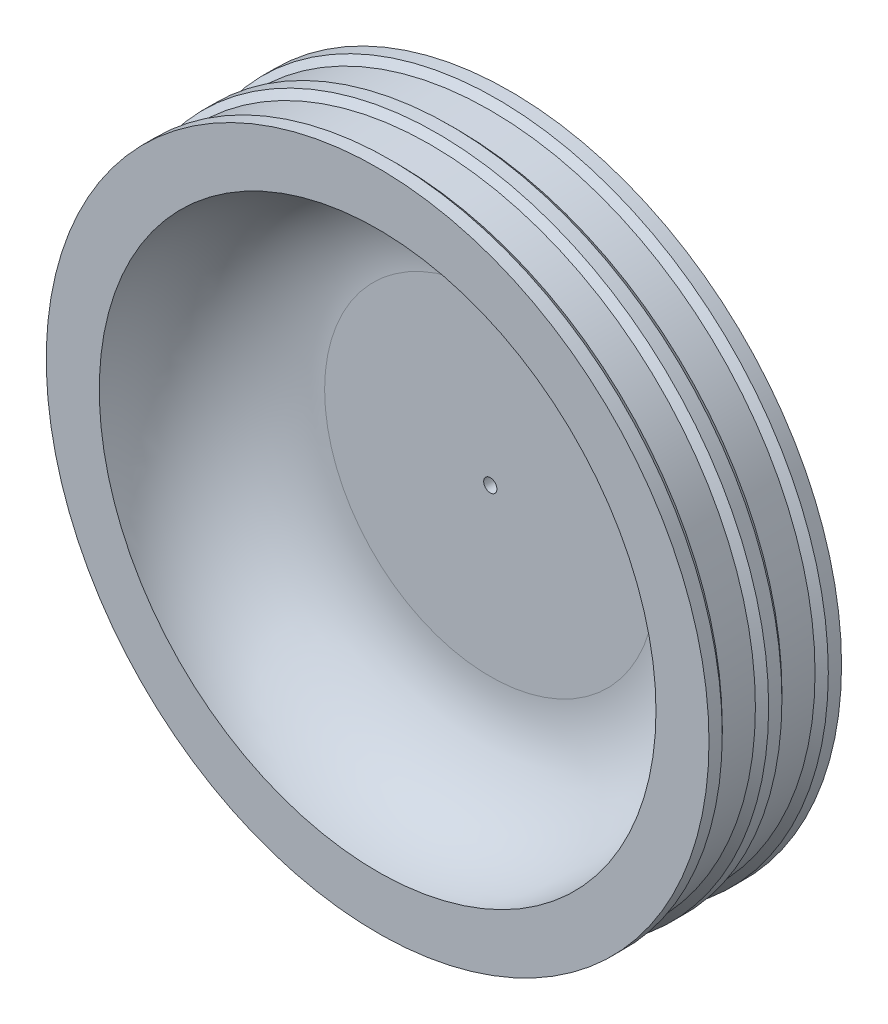
ISO-10303-21;
HEADER;
FILE_DESCRIPTION(('STEP AP214'),'2;1');
FILE_NAME('part.step','',(''),(''),'','','');
FILE_SCHEMA(('AUTOMOTIVE_DESIGN { 1 0 10303 214 1 1 1 1 }'));
ENDSEC;
DATA;
#1=APPLICATION_CONTEXT('core data for automotive mechanical design processes');
#2=APPLICATION_PROTOCOL_DEFINITION('international standard','automotive_design',2000,#1);
#3=PRODUCT_CONTEXT('',#1,'mechanical');
#4=PRODUCT('Part','Part','',(#3));
#5=PRODUCT_RELATED_PRODUCT_CATEGORY('part','',(#4));
#6=PRODUCT_DEFINITION_FORMATION('','',#4);
#7=PRODUCT_DEFINITION_CONTEXT('part definition',#1,'design');
#8=PRODUCT_DEFINITION('design','',#6,#7);
#9=PRODUCT_DEFINITION_SHAPE('','',#8);
#10=(LENGTH_UNIT() NAMED_UNIT(*) SI_UNIT(.MILLI.,.METRE.));
#11=(NAMED_UNIT(*) PLANE_ANGLE_UNIT() SI_UNIT($,.RADIAN.));
#12=(NAMED_UNIT(*) SI_UNIT($,.STERADIAN.) SOLID_ANGLE_UNIT());
#13=UNCERTAINTY_MEASURE_WITH_UNIT(LENGTH_MEASURE(1.E-05),#10,'distance_accuracy_value','');
#14=(GEOMETRIC_REPRESENTATION_CONTEXT(3) GLOBAL_UNCERTAINTY_ASSIGNED_CONTEXT((#13)) GLOBAL_UNIT_ASSIGNED_CONTEXT((#10,
#11,#12)) REPRESENTATION_CONTEXT('',''));
#15=CARTESIAN_POINT('',(0.,0.,0.));
#16=DIRECTION('',(0.,0.,1.));
#17=DIRECTION('',(1.,0.,0.));
#18=AXIS2_PLACEMENT_3D('',#15,#16,#17);
#19=CARTESIAN_POINT('',(0.,0.,20.));
#20=DIRECTION('',(0.,0.,-1.));
#21=DIRECTION('',(-1.,0.,0.));
#22=AXIS2_PLACEMENT_3D('',#19,#20,#21);
#23=CYLINDRICAL_SURFACE('',#22,1.);
#24=CARTESIAN_POINT('',(0.,0.,0.));
#25=DIRECTION('',(0.,0.,1.));
#26=DIRECTION('',(1.,0.,0.));
#27=AXIS2_PLACEMENT_3D('',#24,#25,#26);
#28=CIRCLE('',#27,1.);
#29=CARTESIAN_POINT('',(1.,0.,0.));
#30=VERTEX_POINT('',#29);
#31=EDGE_CURVE('E55',#30,#30,#28,.T.);
#32=ORIENTED_EDGE('',*,*,#31,.F.);
#33=EDGE_LOOP('',(#32));
#34=FACE_BOUND('',#33,.T.);
#35=CARTESIAN_POINT('',(0.,0.,2.99999999999989));
#36=DIRECTION('',(0.,0.,1.));
#37=DIRECTION('',(1.,0.,0.));
#38=AXIS2_PLACEMENT_3D('',#35,#36,#37);
#39=CIRCLE('',#38,1.);
#40=CARTESIAN_POINT('',(1.,0.,2.99999999999989));
#41=VERTEX_POINT('',#40);
#42=EDGE_CURVE('E44',#41,#41,#39,.T.);
#43=ORIENTED_EDGE('',*,*,#42,.T.);
#44=EDGE_LOOP('',(#43));
#45=FACE_BOUND('',#44,.T.);
#46=ADVANCED_FACE('F40',(#34,#45),#23,.F.);
#47=CARTESIAN_POINT('',(0.,0.,20.));
#48=DIRECTION('',(0.,0.,-1.));
#49=DIRECTION('',(-1.,0.,0.));
#50=AXIS2_PLACEMENT_3D('',#47,#48,#49);
#51=CYLINDRICAL_SURFACE('',#50,50.);
#52=CARTESIAN_POINT('',(0.,0.,20.));
#53=DIRECTION('',(0.,0.,1.));
#54=DIRECTION('',(1.,0.,0.));
#55=AXIS2_PLACEMENT_3D('',#52,#53,#54);
#56=CIRCLE('',#55,50.);
#57=CARTESIAN_POINT('',(50.,0.,20.));
#58=VERTEX_POINT('',#57);
#59=EDGE_CURVE('E10',#58,#58,#56,.T.);
#60=ORIENTED_EDGE('',*,*,#59,.F.);
#61=EDGE_LOOP('',(#60));
#62=FACE_BOUND('',#61,.T.);
#63=CARTESIAN_POINT('',(0.,0.,18.));
#64=DIRECTION('',(0.,0.,1.));
#65=DIRECTION('',(1.,0.,0.));
#66=AXIS2_PLACEMENT_3D('',#63,#64,#65);
#67=CIRCLE('',#66,50.);
#68=CARTESIAN_POINT('',(50.,0.,18.));
#69=VERTEX_POINT('',#68);
#70=EDGE_CURVE('E60',#69,#69,#67,.T.);
#71=ORIENTED_EDGE('',*,*,#70,.T.);
#72=EDGE_LOOP('',(#71));
#73=FACE_BOUND('',#72,.T.);
#74=ADVANCED_FACE('F42',(#62,#73),#51,.T.);
#75=CARTESIAN_POINT('',(0.,0.,0.));
#76=DIRECTION('',(0.,0.,1.));
#77=DIRECTION('',(1.,0.,0.));
#78=AXIS2_PLACEMENT_3D('',#75,#76,#77);
#79=CIRCLE('',#78,50.);
#80=CARTESIAN_POINT('',(50.,0.,0.));
#81=VERTEX_POINT('',#80);
#82=EDGE_CURVE('E49',#81,#81,#79,.T.);
#83=ORIENTED_EDGE('',*,*,#82,.T.);
#84=EDGE_LOOP('',(#83));
#85=FACE_BOUND('',#84,.T.);
#86=CARTESIAN_POINT('',(0.,0.,2.));
#87=DIRECTION('',(0.,0.,1.));
#88=DIRECTION('',(1.,0.,0.));
#89=AXIS2_PLACEMENT_3D('',#86,#87,#88);
#90=CIRCLE('',#89,50.);
#91=CARTESIAN_POINT('',(50.,0.,2.));
#92=VERTEX_POINT('',#91);
#93=EDGE_CURVE('E66',#92,#92,#90,.T.);
#94=ORIENTED_EDGE('',*,*,#93,.F.);
#95=EDGE_LOOP('',(#94));
#96=FACE_BOUND('',#95,.T.);
#97=ADVANCED_FACE('F107',(#85,#96),#51,.T.);
#98=CARTESIAN_POINT('',(0.,0.,20.));
#99=DIRECTION('',(0.,0.,1.));
#100=DIRECTION('',(1.,0.,0.));
#101=AXIS2_PLACEMENT_3D('',#98,#99,#100);
#102=PLANE('',#101);
#103=CARTESIAN_POINT('',(0.,0.,20.));
#104=DIRECTION('',(0.,0.,1.));
#105=DIRECTION('',(1.,0.,0.));
#106=AXIS2_PLACEMENT_3D('',#103,#104,#105);
#107=CIRCLE('',#106,42.);
#108=CARTESIAN_POINT('',(42.,0.,20.));
#109=VERTEX_POINT('',#108);
#110=EDGE_CURVE('E96',#109,#109,#107,.T.);
#111=ORIENTED_EDGE('',*,*,#110,.F.);
#112=EDGE_LOOP('',(#111));
#113=FACE_BOUND('',#112,.T.);
#114=ORIENTED_EDGE('',*,*,#59,.T.);
#115=EDGE_LOOP('',(#114));
#116=FACE_BOUND('',#115,.T.);
#117=ADVANCED_FACE('F104',(#113,#116),#102,.T.);
#118=CARTESIAN_POINT('',(0.,0.,0.));
#119=DIRECTION('',(0.,0.,1.));
#120=DIRECTION('',(1.,0.,0.));
#121=AXIS2_PLACEMENT_3D('',#118,#119,#120);
#122=PLANE('',#121);
#123=ORIENTED_EDGE('',*,*,#82,.F.);
#124=EDGE_LOOP('',(#123));
#125=FACE_BOUND('',#124,.T.);
#126=ORIENTED_EDGE('',*,*,#31,.T.);
#127=EDGE_LOOP('',(#126));
#128=FACE_BOUND('',#127,.T.);
#129=ADVANCED_FACE('F106',(#125,#128),#122,.F.);
#130=CARTESIAN_POINT('',(0.,0.,1011.85845146643));
#131=DIRECTION('',(0.,0.,1.));
#132=DIRECTION('',(1.,0.,0.));
#133=AXIS2_PLACEMENT_3D('',#130,#131,#132);
#134=CYLINDRICAL_SURFACE('',#133,49.);
#135=CARTESIAN_POINT('',(0.,0.,2.99999999999989));
#136=DIRECTION('',(0.,0.,1.));
#137=DIRECTION('',(1.,0.,0.));
#138=AXIS2_PLACEMENT_3D('',#135,#136,#137);
#139=CIRCLE('',#138,49.);
#140=CARTESIAN_POINT('',(49.,0.,2.99999999999989));
#141=VERTEX_POINT('',#140);
#142=EDGE_CURVE('E61',#141,#141,#139,.T.);
#143=ORIENTED_EDGE('',*,*,#142,.T.);
#144=EDGE_LOOP('',(#143));
#145=FACE_BOUND('',#144,.T.);
#146=CARTESIAN_POINT('',(0.,0.,8.00000000000001));
#147=DIRECTION('',(0.,0.,1.));
#148=DIRECTION('',(1.,0.,0.));
#149=AXIS2_PLACEMENT_3D('',#146,#147,#148);
#150=CIRCLE('',#149,49.);
#151=CARTESIAN_POINT('',(49.,0.,8.00000000000001));
#152=VERTEX_POINT('',#151);
#153=EDGE_CURVE('E74',#152,#152,#150,.T.);
#154=ORIENTED_EDGE('',*,*,#153,.F.);
#155=EDGE_LOOP('',(#154));
#156=FACE_BOUND('',#155,.T.);
#157=ADVANCED_FACE('F113',(#145,#156),#134,.T.);
#158=CARTESIAN_POINT('',(0.,0.,2.99999999999989));
#159=DIRECTION('',(0.,0.,-1.));
#160=DIRECTION('',(-1.,0.,0.));
#161=AXIS2_PLACEMENT_3D('',#158,#159,#160);
#162=CONICAL_SURFACE('',#161,49.,0.785398163397497);
#163=ORIENTED_EDGE('',*,*,#93,.T.);
#164=EDGE_LOOP('',(#163));
#165=FACE_BOUND('',#164,.T.);
#166=ORIENTED_EDGE('',*,*,#142,.F.);
#167=EDGE_LOOP('',(#166));
#168=FACE_BOUND('',#167,.T.);
#169=ADVANCED_FACE('F129',(#165,#168),#162,.T.);
#170=CARTESIAN_POINT('',(0.,0.,8.9999999999999));
#171=DIRECTION('',(0.,0.,1.));
#172=DIRECTION('',(1.,0.,0.));
#173=AXIS2_PLACEMENT_3D('',#170,#171,#172);
#174=CONICAL_SURFACE('',#173,50.,0.785398163397504);
#175=ORIENTED_EDGE('',*,*,#153,.T.);
#176=EDGE_LOOP('',(#175));
#177=FACE_BOUND('',#176,.T.);
#178=CARTESIAN_POINT('',(0.,0.,8.9999999999999));
#179=DIRECTION('',(0.,0.,1.));
#180=DIRECTION('',(1.,0.,0.));
#181=AXIS2_PLACEMENT_3D('',#178,#179,#180);
#182=CIRCLE('',#181,50.);
#183=CARTESIAN_POINT('',(50.,0.,8.9999999999999));
#184=VERTEX_POINT('',#183);
#185=EDGE_CURVE('E70',#184,#184,#182,.T.);
#186=ORIENTED_EDGE('',*,*,#185,.F.);
#187=EDGE_LOOP('',(#186));
#188=FACE_BOUND('',#187,.T.);
#189=ADVANCED_FACE('F133',(#177,#188),#174,.T.);
#190=CARTESIAN_POINT('',(0.,0.,18.));
#191=DIRECTION('',(0.,0.,1.));
#192=DIRECTION('',(1.,0.,0.));
#193=AXIS2_PLACEMENT_3D('',#190,#191,#192);
#194=CONICAL_SURFACE('',#193,50.,0.785398163397445);
#195=CARTESIAN_POINT('',(0.,0.,17.));
#196=DIRECTION('',(0.,0.,1.));
#197=DIRECTION('',(1.,0.,0.));
#198=AXIS2_PLACEMENT_3D('',#195,#196,#197);
#199=CIRCLE('',#198,49.);
#200=CARTESIAN_POINT('',(49.,0.,17.));
#201=VERTEX_POINT('',#200);
#202=EDGE_CURVE('E81',#201,#201,#199,.T.);
#203=ORIENTED_EDGE('',*,*,#202,.T.);
#204=EDGE_LOOP('',(#203));
#205=FACE_BOUND('',#204,.T.);
#206=ORIENTED_EDGE('',*,*,#70,.F.);
#207=EDGE_LOOP('',(#206));
#208=FACE_BOUND('',#207,.T.);
#209=ADVANCED_FACE('F137',(#205,#208),#194,.T.);
#210=CARTESIAN_POINT('',(0.,0.,1011.85845146643));
#211=DIRECTION('',(0.,0.,1.));
#212=DIRECTION('',(1.,0.,0.));
#213=AXIS2_PLACEMENT_3D('',#210,#211,#212);
#214=CYLINDRICAL_SURFACE('',#213,49.);
#215=CARTESIAN_POINT('',(0.,0.,12.));
#216=DIRECTION('',(0.,0.,1.));
#217=DIRECTION('',(1.,0.,0.));
#218=AXIS2_PLACEMENT_3D('',#215,#216,#217);
#219=CIRCLE('',#218,49.);
#220=CARTESIAN_POINT('',(49.,0.,12.));
#221=VERTEX_POINT('',#220);
#222=EDGE_CURVE('E85',#221,#221,#219,.T.);
#223=ORIENTED_EDGE('',*,*,#222,.T.);
#224=EDGE_LOOP('',(#223));
#225=FACE_BOUND('',#224,.T.);
#226=ORIENTED_EDGE('',*,*,#202,.F.);
#227=EDGE_LOOP('',(#226));
#228=FACE_BOUND('',#227,.T.);
#229=ADVANCED_FACE('F141',(#225,#228),#214,.T.);
#230=CARTESIAN_POINT('',(0.,0.,12.));
#231=DIRECTION('',(0.,0.,-1.));
#232=DIRECTION('',(-1.,0.,0.));
#233=AXIS2_PLACEMENT_3D('',#230,#231,#232);
#234=CONICAL_SURFACE('',#233,49.,0.785398163397393);
#235=CARTESIAN_POINT('',(0.,0.,10.9999999999999));
#236=DIRECTION('',(0.,0.,1.));
#237=DIRECTION('',(1.,0.,0.));
#238=AXIS2_PLACEMENT_3D('',#235,#236,#237);
#239=CIRCLE('',#238,50.);
#240=CARTESIAN_POINT('',(50.,0.,10.9999999999999));
#241=VERTEX_POINT('',#240);
#242=EDGE_CURVE('E65',#241,#241,#239,.T.);
#243=ORIENTED_EDGE('',*,*,#242,.T.);
#244=EDGE_LOOP('',(#243));
#245=FACE_BOUND('',#244,.T.);
#246=ORIENTED_EDGE('',*,*,#222,.F.);
#247=EDGE_LOOP('',(#246));
#248=FACE_BOUND('',#247,.T.);
#249=ADVANCED_FACE('F145',(#245,#248),#234,.T.);
#250=ORIENTED_EDGE('',*,*,#185,.T.);
#251=EDGE_LOOP('',(#250));
#252=FACE_BOUND('',#251,.T.);
#253=ORIENTED_EDGE('',*,*,#242,.F.);
#254=EDGE_LOOP('',(#253));
#255=FACE_BOUND('',#254,.T.);
#256=ADVANCED_FACE('F116',(#252,#255),#51,.T.);
#257=CARTESIAN_POINT('',(0.,0.,2.99999999999989));
#258=DIRECTION('',(0.,0.,1.));
#259=DIRECTION('',(1.,0.,0.));
#260=AXIS2_PLACEMENT_3D('',#257,#258,#259);
#261=PLANE('',#260);
#262=ORIENTED_EDGE('',*,*,#42,.F.);
#263=EDGE_LOOP('',(#262));
#264=FACE_BOUND('',#263,.T.);
#265=CARTESIAN_POINT('',(0.,0.,2.99999999999989));
#266=DIRECTION('',(0.,0.,1.));
#267=DIRECTION('',(1.,0.,0.));
#268=AXIS2_PLACEMENT_3D('',#265,#266,#267);
#269=CIRCLE('',#268,24.9999999999999);
#270=CARTESIAN_POINT('',(24.9999999999999,0.,2.99999999999989));
#271=VERTEX_POINT('',#270);
#272=EDGE_CURVE('E92',#271,#271,#269,.T.);
#273=ORIENTED_EDGE('',*,*,#272,.T.);
#274=EDGE_LOOP('',(#273));
#275=FACE_BOUND('',#274,.T.);
#276=ADVANCED_FACE('F150',(#264,#275),#261,.T.);
#277=CARTESIAN_POINT('',(0.,0.,20.));
#278=DIRECTION('',(0.,0.,1.));
#279=DIRECTION('',(1.,0.,0.));
#280=AXIS2_PLACEMENT_3D('',#277,#278,#279);
#281=TOROIDAL_SURFACE('',#280,24.9999999999999,17.0000000000001);
#282=ORIENTED_EDGE('',*,*,#110,.T.);
#283=EDGE_LOOP('',(#282));
#284=FACE_BOUND('',#283,.T.);
#285=ORIENTED_EDGE('',*,*,#272,.F.);
#286=EDGE_LOOP('',(#285));
#287=FACE_BOUND('',#286,.T.);
#288=ADVANCED_FACE('F101',(#284,#287),#281,.F.);
#289=CLOSED_SHELL('',(#46,#74,#97,#117,#129,#157,#169,#189,#209,#229,#249,#256,#276,#288));
#290=MANIFOLD_SOLID_BREP('B2',#289);
#291=ADVANCED_BREP_SHAPE_REPRESENTATION('',(#18,#290),#14);
#292=SHAPE_DEFINITION_REPRESENTATION(#9,#291);
ENDSEC;
END-ISO-10303-21;
